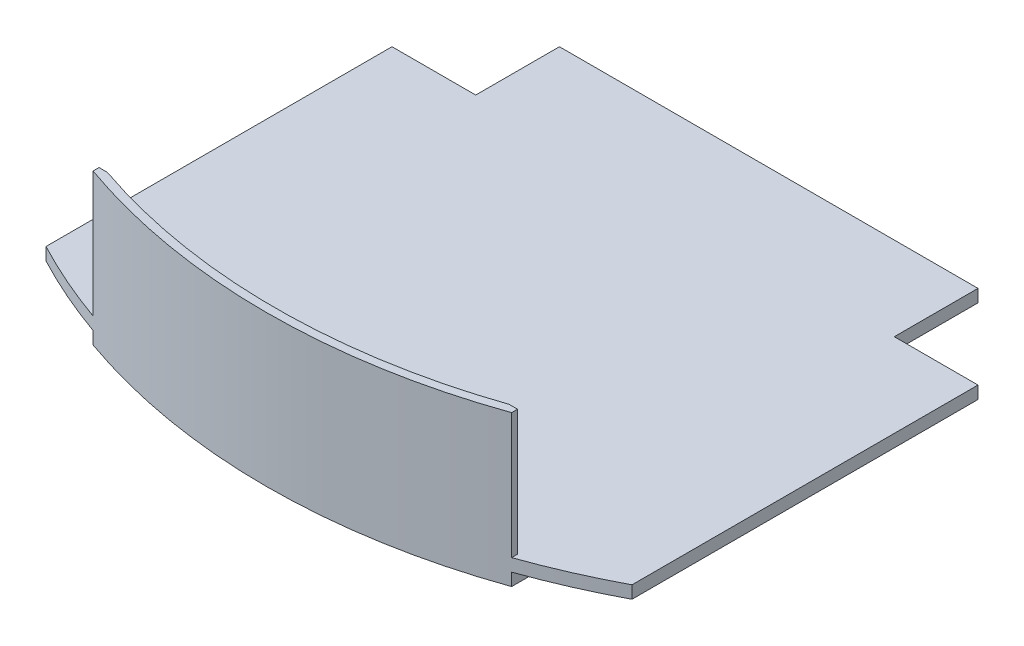
ISO-10303-21;
HEADER;
FILE_DESCRIPTION(('STEP AP214'),'2;1');
FILE_NAME('part.step','',(''),(''),'','','');
FILE_SCHEMA(('AUTOMOTIVE_DESIGN { 1 0 10303 214 1 1 1 1 }'));
ENDSEC;
DATA;
#1=APPLICATION_CONTEXT('core data for automotive mechanical design processes');
#2=APPLICATION_PROTOCOL_DEFINITION('international standard','automotive_design',2000,#1);
#3=PRODUCT_CONTEXT('',#1,'mechanical');
#4=PRODUCT('Part','Part','',(#3));
#5=PRODUCT_RELATED_PRODUCT_CATEGORY('part','',(#4));
#6=PRODUCT_DEFINITION_FORMATION('','',#4);
#7=PRODUCT_DEFINITION_CONTEXT('part definition',#1,'design');
#8=PRODUCT_DEFINITION('design','',#6,#7);
#9=PRODUCT_DEFINITION_SHAPE('','',#8);
#10=(LENGTH_UNIT() NAMED_UNIT(*) SI_UNIT(.MILLI.,.METRE.));
#11=(NAMED_UNIT(*) PLANE_ANGLE_UNIT() SI_UNIT($,.RADIAN.));
#12=(NAMED_UNIT(*) SI_UNIT($,.STERADIAN.) SOLID_ANGLE_UNIT());
#13=UNCERTAINTY_MEASURE_WITH_UNIT(LENGTH_MEASURE(1.E-05),#10,'distance_accuracy_value','');
#14=(GEOMETRIC_REPRESENTATION_CONTEXT(3) GLOBAL_UNCERTAINTY_ASSIGNED_CONTEXT((#13)) GLOBAL_UNIT_ASSIGNED_CONTEXT((#10,
#11,#12)) REPRESENTATION_CONTEXT('',''));
#15=CARTESIAN_POINT('',(0.,0.,0.));
#16=DIRECTION('',(0.,0.,1.));
#17=DIRECTION('',(1.,0.,0.));
#18=AXIS2_PLACEMENT_3D('',#15,#16,#17);
#19=CARTESIAN_POINT('',(-50.,6.,90.));
#20=DIRECTION('',(1.,0.,0.));
#21=DIRECTION('',(0.,0.,-1.));
#22=AXIS2_PLACEMENT_3D('',#19,#20,#21);
#23=PLANE('',#22);
#24=DIRECTION('',(0.,0.,-1.));
#25=VECTOR('',#24,1.);
#26=CARTESIAN_POINT('',(-50.,3.,50.));
#27=LINE('',#26,#25);
#28=CARTESIAN_POINT('',(-50.,3.,50.));
#29=VERTEX_POINT('',#28);
#30=CARTESIAN_POINT('',(-50.,3.,30.));
#31=VERTEX_POINT('',#30);
#32=EDGE_CURVE('E190',#29,#31,#27,.T.);
#33=ORIENTED_EDGE('',*,*,#32,.F.);
#34=DIRECTION('',(0.,-1.,0.));
#35=VECTOR('',#34,1.);
#36=CARTESIAN_POINT('',(-50.,6.,50.));
#37=LINE('',#36,#35);
#38=CARTESIAN_POINT('',(-50.,6.,50.));
#39=VERTEX_POINT('',#38);
#40=EDGE_CURVE('E11',#39,#29,#37,.T.);
#41=ORIENTED_EDGE('',*,*,#40,.F.);
#42=DIRECTION('',(0.,0.,1.));
#43=VECTOR('',#42,1.);
#44=CARTESIAN_POINT('',(-50.,6.,90.));
#45=LINE('',#44,#43);
#46=CARTESIAN_POINT('',(-50.,6.,30.));
#47=VERTEX_POINT('',#46);
#48=EDGE_CURVE('E238',#47,#39,#45,.T.);
#49=ORIENTED_EDGE('',*,*,#48,.F.);
#50=DIRECTION('',(0.,-1.,0.));
#51=VECTOR('',#50,1.);
#52=CARTESIAN_POINT('',(-50.,6.,30.));
#53=LINE('',#52,#51);
#54=EDGE_CURVE('E274',#47,#31,#53,.T.);
#55=ORIENTED_EDGE('',*,*,#54,.T.);
#56=EDGE_LOOP('',(#33,#41,#49,#55));
#57=FACE_BOUND('',#56,.T.);
#58=ADVANCED_FACE('F37',(#57),#23,.F.);
#59=CARTESIAN_POINT('',(50.,6.,90.));
#60=DIRECTION('',(1.,0.,0.));
#61=DIRECTION('',(0.,0.,-1.));
#62=AXIS2_PLACEMENT_3D('',#59,#60,#61);
#63=PLANE('',#62);
#64=DIRECTION('',(0.,-1.,0.));
#65=VECTOR('',#64,1.);
#66=CARTESIAN_POINT('',(50.,6.,50.));
#67=LINE('',#66,#65);
#68=CARTESIAN_POINT('',(50.,6.,50.));
#69=VERTEX_POINT('',#68);
#70=CARTESIAN_POINT('',(50.,3.,50.));
#71=VERTEX_POINT('',#70);
#72=EDGE_CURVE('E268',#69,#71,#67,.T.);
#73=ORIENTED_EDGE('',*,*,#72,.T.);
#74=DIRECTION('',(0.,0.,1.));
#75=VECTOR('',#74,1.);
#76=CARTESIAN_POINT('',(50.,3.,50.));
#77=LINE('',#76,#75);
#78=CARTESIAN_POINT('',(50.,3.,30.));
#79=VERTEX_POINT('',#78);
#80=EDGE_CURVE('E195',#79,#71,#77,.T.);
#81=ORIENTED_EDGE('',*,*,#80,.F.);
#82=DIRECTION('',(0.,-1.,0.));
#83=VECTOR('',#82,1.);
#84=CARTESIAN_POINT('',(50.,6.,30.));
#85=LINE('',#84,#83);
#86=CARTESIAN_POINT('',(50.,6.,30.));
#87=VERTEX_POINT('',#86);
#88=EDGE_CURVE('E271',#87,#79,#85,.T.);
#89=ORIENTED_EDGE('',*,*,#88,.F.);
#90=DIRECTION('',(0.,0.,1.));
#91=VECTOR('',#90,1.);
#92=CARTESIAN_POINT('',(50.,6.,90.));
#93=LINE('',#92,#91);
#94=EDGE_CURVE('E287',#87,#69,#93,.T.);
#95=ORIENTED_EDGE('',*,*,#94,.T.);
#96=EDGE_LOOP('',(#73,#81,#89,#95));
#97=FACE_BOUND('',#96,.T.);
#98=ADVANCED_FACE('F317',(#97),#63,.T.);
#99=CARTESIAN_POINT('',(-143.563874270696,6.,30.));
#100=DIRECTION('',(0.,0.,-1.));
#101=DIRECTION('',(-1.,0.,0.));
#102=AXIS2_PLACEMENT_3D('',#99,#100,#101);
#103=PLANE('',#102);
#104=ORIENTED_EDGE('',*,*,#88,.T.);
#105=DIRECTION('',(1.,0.,0.));
#106=VECTOR('',#105,1.);
#107=CARTESIAN_POINT('',(-50.,3.,30.));
#108=LINE('',#107,#106);
#109=EDGE_CURVE('E192',#31,#79,#108,.T.);
#110=ORIENTED_EDGE('',*,*,#109,.F.);
#111=ORIENTED_EDGE('',*,*,#54,.F.);
#112=DIRECTION('',(1.,0.,0.));
#113=VECTOR('',#112,1.);
#114=CARTESIAN_POINT('',(-143.563874270696,6.,30.));
#115=LINE('',#114,#113);
#116=EDGE_CURVE('E277',#47,#87,#115,.T.);
#117=ORIENTED_EDGE('',*,*,#116,.T.);
#118=EDGE_LOOP('',(#104,#110,#111,#117));
#119=FACE_BOUND('',#118,.T.);
#120=ADVANCED_FACE('F320',(#119),#103,.T.);
#121=DIRECTION('',(0.,0.,1.));
#122=VECTOR('',#121,1.);
#123=CARTESIAN_POINT('',(-50.,3.,141.42135623731));
#124=LINE('',#123,#122);
#125=CARTESIAN_POINT('',(-50.,3.,141.42135623731));
#126=VERTEX_POINT('',#125);
#127=EDGE_CURVE('E224',#29,#126,#124,.T.);
#128=ORIENTED_EDGE('',*,*,#127,.F.);
#129=DIRECTION('',(0.,-1.,0.));
#130=VECTOR('',#129,1.);
#131=CARTESIAN_POINT('',(-50.,3.,50.));
#132=LINE('',#131,#130);
#133=CARTESIAN_POINT('',(-50.,0.,50.));
#134=VERTEX_POINT('',#133);
#135=EDGE_CURVE('E201',#29,#134,#132,.T.);
#136=ORIENTED_EDGE('',*,*,#135,.T.);
#137=DIRECTION('',(0.,0.,1.));
#138=VECTOR('',#137,1.);
#139=CARTESIAN_POINT('',(-50.,0.,90.));
#140=LINE('',#139,#138);
#141=CARTESIAN_POINT('',(-50.,0.,141.42135623731));
#142=VERTEX_POINT('',#141);
#143=EDGE_CURVE('E282',#134,#142,#140,.T.);
#144=ORIENTED_EDGE('',*,*,#143,.T.);
#145=DIRECTION('',(0.,-1.,0.));
#146=VECTOR('',#145,1.);
#147=CARTESIAN_POINT('',(-50.,3.,141.42135623731));
#148=LINE('',#147,#146);
#149=EDGE_CURVE('E227',#126,#142,#148,.T.);
#150=ORIENTED_EDGE('',*,*,#149,.F.);
#151=EDGE_LOOP('',(#128,#136,#144,#150));
#152=FACE_BOUND('',#151,.T.);
#153=ADVANCED_FACE('F39',(#152),#23,.F.);
#154=CARTESIAN_POINT('',(-143.563874270696,6.,50.));
#155=DIRECTION('',(0.,0.,1.));
#156=DIRECTION('',(1.,0.,0.));
#157=AXIS2_PLACEMENT_3D('',#154,#155,#156);
#158=PLANE('',#157);
#159=ORIENTED_EDGE('',*,*,#40,.T.);
#160=DIRECTION('',(1.,0.,0.));
#161=VECTOR('',#160,1.);
#162=CARTESIAN_POINT('',(-50.,3.,50.));
#163=LINE('',#162,#161);
#164=CARTESIAN_POINT('',(-70.,3.,50.));
#165=VERTEX_POINT('',#164);
#166=EDGE_CURVE('E221',#165,#29,#163,.T.);
#167=ORIENTED_EDGE('',*,*,#166,.F.);
#168=DIRECTION('',(0.,-1.,0.));
#169=VECTOR('',#168,1.);
#170=CARTESIAN_POINT('',(-70.,6.,50.));
#171=LINE('',#170,#169);
#172=CARTESIAN_POINT('',(-70.,6.,50.));
#173=VERTEX_POINT('',#172);
#174=EDGE_CURVE('E47',#173,#165,#171,.T.);
#175=ORIENTED_EDGE('',*,*,#174,.F.);
#176=DIRECTION('',(-1.,0.,0.));
#177=VECTOR('',#176,1.);
#178=CARTESIAN_POINT('',(-143.563874270696,6.,50.));
#179=LINE('',#178,#177);
#180=EDGE_CURVE('E241',#39,#173,#179,.T.);
#181=ORIENTED_EDGE('',*,*,#180,.F.);
#182=EDGE_LOOP('',(#159,#167,#175,#181));
#183=FACE_BOUND('',#182,.T.);
#184=ADVANCED_FACE('F331',(#183),#158,.F.);
#185=CARTESIAN_POINT('',(-70.,6.,90.));
#186=DIRECTION('',(1.,0.,0.));
#187=DIRECTION('',(0.,0.,-1.));
#188=AXIS2_PLACEMENT_3D('',#185,#186,#187);
#189=PLANE('',#188);
#190=ORIENTED_EDGE('',*,*,#174,.T.);
#191=DIRECTION('',(0.,0.,-1.));
#192=VECTOR('',#191,1.);
#193=CARTESIAN_POINT('',(-70.,3.,50.));
#194=LINE('',#193,#192);
#195=CARTESIAN_POINT('',(-70.,3.,132.664991614216));
#196=VERTEX_POINT('',#195);
#197=EDGE_CURVE('E219',#196,#165,#194,.T.);
#198=ORIENTED_EDGE('',*,*,#197,.F.);
#199=DIRECTION('',(0.,-1.,0.));
#200=VECTOR('',#199,1.);
#201=CARTESIAN_POINT('',(-70.,6.,132.664991614216));
#202=LINE('',#201,#200);
#203=CARTESIAN_POINT('',(-70.,6.,132.664991614216));
#204=VERTEX_POINT('',#203);
#205=EDGE_CURVE('E259',#204,#196,#202,.T.);
#206=ORIENTED_EDGE('',*,*,#205,.F.);
#207=DIRECTION('',(0.,0.,1.));
#208=VECTOR('',#207,1.);
#209=CARTESIAN_POINT('',(-70.,6.,90.));
#210=LINE('',#209,#208);
#211=EDGE_CURVE('E243',#173,#204,#210,.T.);
#212=ORIENTED_EDGE('',*,*,#211,.F.);
#213=EDGE_LOOP('',(#190,#198,#206,#212));
#214=FACE_BOUND('',#213,.T.);
#215=ADVANCED_FACE('F334',(#214),#189,.F.);
#216=CARTESIAN_POINT('',(0.,6.,0.));
#217=DIRECTION('',(0.,-1.,0.));
#218=DIRECTION('',(0.,0.,-1.));
#219=AXIS2_PLACEMENT_3D('',#216,#217,#218);
#220=CYLINDRICAL_SURFACE('',#219,150.);
#221=CARTESIAN_POINT('',(0.,0.,0.));
#222=DIRECTION('',(0.,1.,0.));
#223=DIRECTION('',(0.,0.,1.));
#224=AXIS2_PLACEMENT_3D('',#221,#222,#223);
#225=CIRCLE('',#224,150.);
#226=CARTESIAN_POINT('',(50.,0.,141.42135623731));
#227=VERTEX_POINT('',#226);
#228=EDGE_CURVE('E279',#142,#227,#225,.T.);
#229=ORIENTED_EDGE('',*,*,#228,.T.);
#230=DIRECTION('',(0.,-1.,0.));
#231=VECTOR('',#230,1.);
#232=CARTESIAN_POINT('',(50.,3.,141.42135623731));
#233=LINE('',#232,#231);
#234=CARTESIAN_POINT('',(50.,3.,141.42135623731));
#235=VERTEX_POINT('',#234);
#236=EDGE_CURVE('E215',#235,#227,#233,.T.);
#237=ORIENTED_EDGE('',*,*,#236,.F.);
#238=CARTESIAN_POINT('',(-2.09485206958959E-11,3.,-4.78506123613442E-11));
#239=DIRECTION('',(0.,-1.,0.));
#240=DIRECTION('',(0.,0.,1.));
#241=AXIS2_PLACEMENT_3D('',#238,#239,#240);
#242=CIRCLE('',#241,150.000000000052);
#243=CARTESIAN_POINT('',(70.,3.,132.664991614216));
#244=VERTEX_POINT('',#243);
#245=EDGE_CURVE('E204',#244,#235,#242,.T.);
#246=ORIENTED_EDGE('',*,*,#245,.F.);
#247=DIRECTION('',(0.,-1.,0.));
#248=VECTOR('',#247,1.);
#249=CARTESIAN_POINT('',(70.,6.,132.664991614216));
#250=LINE('',#249,#248);
#251=CARTESIAN_POINT('',(70.,6.,132.664991614216));
#252=VERTEX_POINT('',#251);
#253=EDGE_CURVE('E262',#252,#244,#250,.T.);
#254=ORIENTED_EDGE('',*,*,#253,.F.);
#255=CARTESIAN_POINT('',(0.,6.,0.));
#256=DIRECTION('',(0.,1.,0.));
#257=DIRECTION('',(0.,0.,1.));
#258=AXIS2_PLACEMENT_3D('',#255,#256,#257);
#259=CIRCLE('',#258,150.);
#260=CARTESIAN_POINT('',(50.,6.,141.42135623731));
#261=VERTEX_POINT('',#260);
#262=EDGE_CURVE('E245',#261,#252,#259,.T.);
#263=ORIENTED_EDGE('',*,*,#262,.F.);
#264=DIRECTION('',(0.,-1.,0.));
#265=VECTOR('',#264,1.);
#266=CARTESIAN_POINT('',(50.,36.,141.42135623731));
#267=LINE('',#266,#265);
#268=CARTESIAN_POINT('',(50.,36.,141.42135623731));
#269=VERTEX_POINT('',#268);
#270=EDGE_CURVE('E235',#269,#261,#267,.T.);
#271=ORIENTED_EDGE('',*,*,#270,.F.);
#272=CARTESIAN_POINT('',(0.,36.,-1.94289029309402E-12));
#273=DIRECTION('',(0.,1.,0.));
#274=DIRECTION('',(0.,0.,1.));
#275=AXIS2_PLACEMENT_3D('',#272,#273,#274);
#276=CIRCLE('',#275,150.000000000002);
#277=CARTESIAN_POINT('',(-50.,36.,141.42135623731));
#278=VERTEX_POINT('',#277);
#279=EDGE_CURVE('E232',#278,#269,#276,.T.);
#280=ORIENTED_EDGE('',*,*,#279,.F.);
#281=DIRECTION('',(0.,-1.,0.));
#282=VECTOR('',#281,1.);
#283=CARTESIAN_POINT('',(-50.,36.,141.42135623731));
#284=LINE('',#283,#282);
#285=CARTESIAN_POINT('',(-50.,6.,141.42135623731));
#286=VERTEX_POINT('',#285);
#287=EDGE_CURVE('E284',#278,#286,#284,.T.);
#288=ORIENTED_EDGE('',*,*,#287,.T.);
#289=EDGE_CURVE('E254',#204,#286,#259,.T.);
#290=ORIENTED_EDGE('',*,*,#289,.F.);
#291=ORIENTED_EDGE('',*,*,#205,.T.);
#292=CARTESIAN_POINT('',(1.76733627732517E-11,3.,-4.03843625207401E-11));
#293=DIRECTION('',(0.,-1.,0.));
#294=DIRECTION('',(0.,0.,1.));
#295=AXIS2_PLACEMENT_3D('',#292,#293,#294);
#296=CIRCLE('',#295,150.000000000044);
#297=EDGE_CURVE('E217',#126,#196,#296,.T.);
#298=ORIENTED_EDGE('',*,*,#297,.F.);
#299=ORIENTED_EDGE('',*,*,#149,.T.);
#300=EDGE_LOOP('',(#229,#237,#246,#254,#263,#271,#280,#288,#290,#291,#298,#299));
#301=FACE_BOUND('',#300,.T.);
#302=ADVANCED_FACE('F309',(#301),#220,.T.);
#303=CARTESIAN_POINT('',(70.,6.,90.));
#304=DIRECTION('',(1.,0.,0.));
#305=DIRECTION('',(0.,0.,-1.));
#306=AXIS2_PLACEMENT_3D('',#303,#304,#305);
#307=PLANE('',#306);
#308=DIRECTION('',(0.,0.,1.));
#309=VECTOR('',#308,1.);
#310=CARTESIAN_POINT('',(70.,3.,50.));
#311=LINE('',#310,#309);
#312=CARTESIAN_POINT('',(70.,3.,50.));
#313=VERTEX_POINT('',#312);
#314=EDGE_CURVE('E213',#313,#244,#311,.T.);
#315=ORIENTED_EDGE('',*,*,#314,.F.);
#316=DIRECTION('',(0.,-1.,0.));
#317=VECTOR('',#316,1.);
#318=CARTESIAN_POINT('',(70.,6.,50.));
#319=LINE('',#318,#317);
#320=CARTESIAN_POINT('',(70.,6.,50.));
#321=VERTEX_POINT('',#320);
#322=EDGE_CURVE('E265',#321,#313,#319,.T.);
#323=ORIENTED_EDGE('',*,*,#322,.F.);
#324=DIRECTION('',(0.,0.,1.));
#325=VECTOR('',#324,1.);
#326=CARTESIAN_POINT('',(70.,6.,90.));
#327=LINE('',#326,#325);
#328=EDGE_CURVE('E248',#321,#252,#327,.T.);
#329=ORIENTED_EDGE('',*,*,#328,.T.);
#330=ORIENTED_EDGE('',*,*,#253,.T.);
#331=EDGE_LOOP('',(#315,#323,#329,#330));
#332=FACE_BOUND('',#331,.T.);
#333=ADVANCED_FACE('F297',(#332),#307,.T.);
#334=CARTESIAN_POINT('',(-143.563874270696,6.,50.));
#335=DIRECTION('',(0.,0.,-1.));
#336=DIRECTION('',(-1.,0.,0.));
#337=AXIS2_PLACEMENT_3D('',#334,#335,#336);
#338=PLANE('',#337);
#339=DIRECTION('',(1.,0.,0.));
#340=VECTOR('',#339,1.);
#341=CARTESIAN_POINT('',(50.,3.,50.));
#342=LINE('',#341,#340);
#343=EDGE_CURVE('E211',#71,#313,#342,.T.);
#344=ORIENTED_EDGE('',*,*,#343,.F.);
#345=ORIENTED_EDGE('',*,*,#72,.F.);
#346=DIRECTION('',(1.,0.,0.));
#347=VECTOR('',#346,1.);
#348=CARTESIAN_POINT('',(-143.563874270696,6.,50.));
#349=LINE('',#348,#347);
#350=EDGE_CURVE('E288',#69,#321,#349,.T.);
#351=ORIENTED_EDGE('',*,*,#350,.T.);
#352=ORIENTED_EDGE('',*,*,#322,.T.);
#353=EDGE_LOOP('',(#344,#345,#351,#352));
#354=FACE_BOUND('',#353,.T.);
#355=ADVANCED_FACE('F314',(#354),#338,.T.);
#356=DIRECTION('',(0.,-1.,0.));
#357=VECTOR('',#356,1.);
#358=CARTESIAN_POINT('',(50.,3.,50.));
#359=LINE('',#358,#357);
#360=CARTESIAN_POINT('',(50.,0.,50.));
#361=VERTEX_POINT('',#360);
#362=EDGE_CURVE('E55',#71,#361,#359,.T.);
#363=ORIENTED_EDGE('',*,*,#362,.F.);
#364=DIRECTION('',(0.,0.,-1.));
#365=VECTOR('',#364,1.);
#366=CARTESIAN_POINT('',(50.,3.,141.42135623731));
#367=LINE('',#366,#365);
#368=EDGE_CURVE('E208',#235,#71,#367,.T.);
#369=ORIENTED_EDGE('',*,*,#368,.F.);
#370=ORIENTED_EDGE('',*,*,#236,.T.);
#371=DIRECTION('',(0.,0.,1.));
#372=VECTOR('',#371,1.);
#373=CARTESIAN_POINT('',(50.,0.,90.));
#374=LINE('',#373,#372);
#375=EDGE_CURVE('E62',#361,#227,#374,.T.);
#376=ORIENTED_EDGE('',*,*,#375,.F.);
#377=EDGE_LOOP('',(#363,#369,#370,#376));
#378=FACE_BOUND('',#377,.T.);
#379=ADVANCED_FACE('F373',(#378),#63,.T.);
#380=CARTESIAN_POINT('',(-143.563874270696,6.,90.));
#381=DIRECTION('',(0.,1.,0.));
#382=DIRECTION('',(0.,0.,1.));
#383=AXIS2_PLACEMENT_3D('',#380,#381,#382);
#384=PLANE('',#383);
#385=DIRECTION('',(-1.,0.,0.));
#386=VECTOR('',#385,1.);
#387=CARTESIAN_POINT('',(70.001025,6.,140.));
#388=LINE('',#387,#386);
#389=CARTESIAN_POINT('',(-48.,6.,140.));
#390=VERTEX_POINT('',#389);
#391=CARTESIAN_POINT('',(-50.,6.,140.));
#392=VERTEX_POINT('',#391);
#393=EDGE_CURVE('E341',#390,#392,#388,.T.);
#394=ORIENTED_EDGE('',*,*,#393,.F.);
#395=CARTESIAN_POINT('',(0.,6.,-1.99840144432528E-12));
#396=DIRECTION('',(0.,-1.,0.));
#397=DIRECTION('',(0.,0.,1.));
#398=AXIS2_PLACEMENT_3D('',#395,#396,#397);
#399=CIRCLE('',#398,148.000000000002);
#400=CARTESIAN_POINT('',(48.,6.,140.));
#401=VERTEX_POINT('',#400);
#402=EDGE_CURVE('E360',#401,#390,#399,.T.);
#403=ORIENTED_EDGE('',*,*,#402,.F.);
#404=CARTESIAN_POINT('',(50.,6.,140.));
#405=VERTEX_POINT('',#404);
#406=EDGE_CURVE('E166',#405,#401,#388,.T.);
#407=ORIENTED_EDGE('',*,*,#406,.F.);
#408=DIRECTION('',(0.,0.,-1.));
#409=VECTOR('',#408,1.);
#410=CARTESIAN_POINT('',(50.,6.,50.));
#411=LINE('',#410,#409);
#412=EDGE_CURVE('E233',#261,#405,#411,.T.);
#413=ORIENTED_EDGE('',*,*,#412,.F.);
#414=ORIENTED_EDGE('',*,*,#262,.T.);
#415=ORIENTED_EDGE('',*,*,#328,.F.);
#416=ORIENTED_EDGE('',*,*,#350,.F.);
#417=ORIENTED_EDGE('',*,*,#94,.F.);
#418=ORIENTED_EDGE('',*,*,#116,.F.);
#419=ORIENTED_EDGE('',*,*,#48,.T.);
#420=ORIENTED_EDGE('',*,*,#180,.T.);
#421=ORIENTED_EDGE('',*,*,#211,.T.);
#422=ORIENTED_EDGE('',*,*,#289,.T.);
#423=DIRECTION('',(0.,0.,1.));
#424=VECTOR('',#423,1.);
#425=CARTESIAN_POINT('',(-50.,6.,50.));
#426=LINE('',#425,#424);
#427=EDGE_CURVE('E41',#392,#286,#426,.T.);
#428=ORIENTED_EDGE('',*,*,#427,.F.);
#429=EDGE_LOOP('',(#394,#403,#407,#413,#414,#415,#416,#417,#418,#419,#420,#421,#422,#428));
#430=FACE_BOUND('',#429,.T.);
#431=ADVANCED_FACE('F301',(#430),#384,.T.);
#432=CARTESIAN_POINT('',(-143.563874270696,0.,90.));
#433=DIRECTION('',(0.,1.,0.));
#434=DIRECTION('',(0.,0.,1.));
#435=AXIS2_PLACEMENT_3D('',#432,#433,#434);
#436=PLANE('',#435);
#437=ORIENTED_EDGE('',*,*,#143,.F.);
#438=DIRECTION('',(-1.,0.,0.));
#439=VECTOR('',#438,1.);
#440=CARTESIAN_POINT('',(-50.,0.,50.));
#441=LINE('',#440,#439);
#442=EDGE_CURVE('E193',#361,#134,#441,.T.);
#443=ORIENTED_EDGE('',*,*,#442,.F.);
#444=ORIENTED_EDGE('',*,*,#375,.T.);
#445=ORIENTED_EDGE('',*,*,#228,.F.);
#446=EDGE_LOOP('',(#437,#443,#444,#445));
#447=FACE_BOUND('',#446,.T.);
#448=ADVANCED_FACE('F385',(#447),#436,.F.);
#449=CARTESIAN_POINT('',(-50.,36.,50.));
#450=DIRECTION('',(1.,0.,0.));
#451=DIRECTION('',(0.,0.,-1.));
#452=AXIS2_PLACEMENT_3D('',#449,#450,#451);
#453=PLANE('',#452);
#454=DIRECTION('',(0.,0.,1.));
#455=VECTOR('',#454,1.);
#456=CARTESIAN_POINT('',(-50.,36.,50.));
#457=LINE('',#456,#455);
#458=CARTESIAN_POINT('',(-50.,36.,140.));
#459=VERTEX_POINT('',#458);
#460=EDGE_CURVE('E230',#459,#278,#457,.T.);
#461=ORIENTED_EDGE('',*,*,#460,.F.);
#462=DIRECTION('',(0.,1.,0.));
#463=VECTOR('',#462,1.);
#464=CARTESIAN_POINT('',(-50.,36.,140.));
#465=LINE('',#464,#463);
#466=EDGE_CURVE('E355',#392,#459,#465,.T.);
#467=ORIENTED_EDGE('',*,*,#466,.F.);
#468=ORIENTED_EDGE('',*,*,#427,.T.);
#469=ORIENTED_EDGE('',*,*,#287,.F.);
#470=EDGE_LOOP('',(#461,#467,#468,#469));
#471=FACE_BOUND('',#470,.T.);
#472=ADVANCED_FACE('F354',(#471),#453,.F.);
#473=CARTESIAN_POINT('',(50.,36.,50.));
#474=DIRECTION('',(-1.,0.,0.));
#475=DIRECTION('',(0.,0.,1.));
#476=AXIS2_PLACEMENT_3D('',#473,#474,#475);
#477=PLANE('',#476);
#478=ORIENTED_EDGE('',*,*,#412,.T.);
#479=DIRECTION('',(0.,-1.,0.));
#480=VECTOR('',#479,1.);
#481=CARTESIAN_POINT('',(50.,36.,140.));
#482=LINE('',#481,#480);
#483=CARTESIAN_POINT('',(50.,36.,140.));
#484=VERTEX_POINT('',#483);
#485=EDGE_CURVE('E180',#484,#405,#482,.T.);
#486=ORIENTED_EDGE('',*,*,#485,.F.);
#487=DIRECTION('',(0.,0.,-1.));
#488=VECTOR('',#487,1.);
#489=CARTESIAN_POINT('',(50.,36.,50.));
#490=LINE('',#489,#488);
#491=EDGE_CURVE('E179',#269,#484,#490,.T.);
#492=ORIENTED_EDGE('',*,*,#491,.F.);
#493=ORIENTED_EDGE('',*,*,#270,.T.);
#494=EDGE_LOOP('',(#478,#486,#492,#493));
#495=FACE_BOUND('',#494,.T.);
#496=ADVANCED_FACE('F352',(#495),#477,.F.);
#497=CARTESIAN_POINT('',(0.,36.,-1.94289029309402E-12));
#498=DIRECTION('',(0.,1.,0.));
#499=DIRECTION('',(0.,0.,1.));
#500=AXIS2_PLACEMENT_3D('',#497,#498,#499);
#501=PLANE('',#500);
#502=DIRECTION('',(-1.,0.,0.));
#503=VECTOR('',#502,1.);
#504=CARTESIAN_POINT('',(70.001025,36.,140.));
#505=LINE('',#504,#503);
#506=CARTESIAN_POINT('',(48.,36.,140.));
#507=VERTEX_POINT('',#506);
#508=EDGE_CURVE('E164',#484,#507,#505,.T.);
#509=ORIENTED_EDGE('',*,*,#508,.T.);
#510=CARTESIAN_POINT('',(0.,36.,0.));
#511=DIRECTION('',(0.,1.,0.));
#512=DIRECTION('',(0.,0.,1.));
#513=AXIS2_PLACEMENT_3D('',#510,#511,#512);
#514=CIRCLE('',#513,148.);
#515=CARTESIAN_POINT('',(-48.,36.,140.));
#516=VERTEX_POINT('',#515);
#517=EDGE_CURVE('E171',#516,#507,#514,.T.);
#518=ORIENTED_EDGE('',*,*,#517,.F.);
#519=EDGE_CURVE('E181',#516,#459,#505,.T.);
#520=ORIENTED_EDGE('',*,*,#519,.T.);
#521=ORIENTED_EDGE('',*,*,#460,.T.);
#522=ORIENTED_EDGE('',*,*,#279,.T.);
#523=ORIENTED_EDGE('',*,*,#491,.T.);
#524=EDGE_LOOP('',(#509,#518,#520,#521,#522,#523));
#525=FACE_BOUND('',#524,.T.);
#526=ADVANCED_FACE('F176',(#525),#501,.T.);
#527=CARTESIAN_POINT('',(1.76733627732517E-11,3.,-4.03843625207401E-11));
#528=DIRECTION('',(0.,1.,0.));
#529=DIRECTION('',(0.,0.,1.));
#530=AXIS2_PLACEMENT_3D('',#527,#528,#529);
#531=PLANE('',#530);
#532=ORIENTED_EDGE('',*,*,#297,.T.);
#533=ORIENTED_EDGE('',*,*,#197,.T.);
#534=ORIENTED_EDGE('',*,*,#166,.T.);
#535=ORIENTED_EDGE('',*,*,#127,.T.);
#536=EDGE_LOOP('',(#532,#533,#534,#535));
#537=FACE_BOUND('',#536,.T.);
#538=ADVANCED_FACE('F384',(#537),#531,.F.);
#539=CARTESIAN_POINT('',(-2.09485206958959E-11,3.,-4.78506123613442E-11));
#540=DIRECTION('',(0.,1.,0.));
#541=DIRECTION('',(0.,0.,1.));
#542=AXIS2_PLACEMENT_3D('',#539,#540,#541);
#543=PLANE('',#542);
#544=ORIENTED_EDGE('',*,*,#245,.T.);
#545=ORIENTED_EDGE('',*,*,#368,.T.);
#546=ORIENTED_EDGE('',*,*,#343,.T.);
#547=ORIENTED_EDGE('',*,*,#314,.T.);
#548=EDGE_LOOP('',(#544,#545,#546,#547));
#549=FACE_BOUND('',#548,.T.);
#550=ADVANCED_FACE('F312',(#549),#543,.F.);
#551=CARTESIAN_POINT('',(-50.,3.,50.));
#552=DIRECTION('',(0.,0.,1.));
#553=DIRECTION('',(1.,0.,0.));
#554=AXIS2_PLACEMENT_3D('',#551,#552,#553);
#555=PLANE('',#554);
#556=ORIENTED_EDGE('',*,*,#442,.T.);
#557=ORIENTED_EDGE('',*,*,#135,.F.);
#558=DIRECTION('',(-1.,0.,0.));
#559=VECTOR('',#558,1.);
#560=CARTESIAN_POINT('',(-50.,3.,50.));
#561=LINE('',#560,#559);
#562=EDGE_CURVE('E197',#71,#29,#561,.T.);
#563=ORIENTED_EDGE('',*,*,#562,.F.);
#564=ORIENTED_EDGE('',*,*,#362,.T.);
#565=EDGE_LOOP('',(#556,#557,#563,#564));
#566=FACE_BOUND('',#565,.T.);
#567=ADVANCED_FACE('F550',(#566),#555,.F.);
#568=CARTESIAN_POINT('',(-50.,3.,30.));
#569=DIRECTION('',(0.,-1.,0.));
#570=DIRECTION('',(0.,0.,-1.));
#571=AXIS2_PLACEMENT_3D('',#568,#569,#570);
#572=PLANE('',#571);
#573=ORIENTED_EDGE('',*,*,#32,.T.);
#574=ORIENTED_EDGE('',*,*,#109,.T.);
#575=ORIENTED_EDGE('',*,*,#80,.T.);
#576=ORIENTED_EDGE('',*,*,#562,.T.);
#577=EDGE_LOOP('',(#573,#574,#575,#576));
#578=FACE_BOUND('',#577,.T.);
#579=ADVANCED_FACE('F473',(#578),#572,.T.);
#580=CARTESIAN_POINT('',(0.,6.,0.));
#581=DIRECTION('',(0.,-1.,0.));
#582=DIRECTION('',(0.,0.,-1.));
#583=AXIS2_PLACEMENT_3D('',#580,#581,#582);
#584=CYLINDRICAL_SURFACE('',#583,148.);
#585=ORIENTED_EDGE('',*,*,#402,.T.);
#586=DIRECTION('',(0.,-1.,0.));
#587=VECTOR('',#586,1.);
#588=CARTESIAN_POINT('',(-48.,36.,140.));
#589=LINE('',#588,#587);
#590=EDGE_CURVE('E170',#516,#390,#589,.T.);
#591=ORIENTED_EDGE('',*,*,#590,.F.);
#592=ORIENTED_EDGE('',*,*,#517,.T.);
#593=DIRECTION('',(0.,-1.,0.));
#594=VECTOR('',#593,1.);
#595=CARTESIAN_POINT('',(48.,36.,140.));
#596=LINE('',#595,#594);
#597=EDGE_CURVE('E160',#507,#401,#596,.T.);
#598=ORIENTED_EDGE('',*,*,#597,.T.);
#599=EDGE_LOOP('',(#585,#591,#592,#598));
#600=FACE_BOUND('',#599,.T.);
#601=ADVANCED_FACE('F184',(#600),#584,.F.);
#602=CARTESIAN_POINT('',(70.001025,36.,140.));
#603=DIRECTION('',(0.,0.,1.));
#604=DIRECTION('',(1.,0.,0.));
#605=AXIS2_PLACEMENT_3D('',#602,#603,#604);
#606=PLANE('',#605);
#607=ORIENTED_EDGE('',*,*,#485,.T.);
#608=ORIENTED_EDGE('',*,*,#406,.T.);
#609=ORIENTED_EDGE('',*,*,#597,.F.);
#610=ORIENTED_EDGE('',*,*,#508,.F.);
#611=EDGE_LOOP('',(#607,#608,#609,#610));
#612=FACE_BOUND('',#611,.T.);
#613=ADVANCED_FACE('F163',(#612),#606,.F.);
#614=ORIENTED_EDGE('',*,*,#393,.T.);
#615=ORIENTED_EDGE('',*,*,#466,.T.);
#616=ORIENTED_EDGE('',*,*,#519,.F.);
#617=ORIENTED_EDGE('',*,*,#590,.T.);
#618=EDGE_LOOP('',(#614,#615,#616,#617));
#619=FACE_BOUND('',#618,.T.);
#620=ADVANCED_FACE('F361',(#619),#606,.F.);
#621=CLOSED_SHELL('',(#58,#98,#120,#153,#184,#215,#302,#333,#355,#379,#431,#448,#472,#496,#526,
#538,#550,#567,#579,#601,#613,#620));
#622=MANIFOLD_SOLID_BREP('B2',#621);
#623=ADVANCED_BREP_SHAPE_REPRESENTATION('',(#18,#622),#14);
#624=SHAPE_DEFINITION_REPRESENTATION(#9,#623);
ENDSEC;
END-ISO-10303-21;
